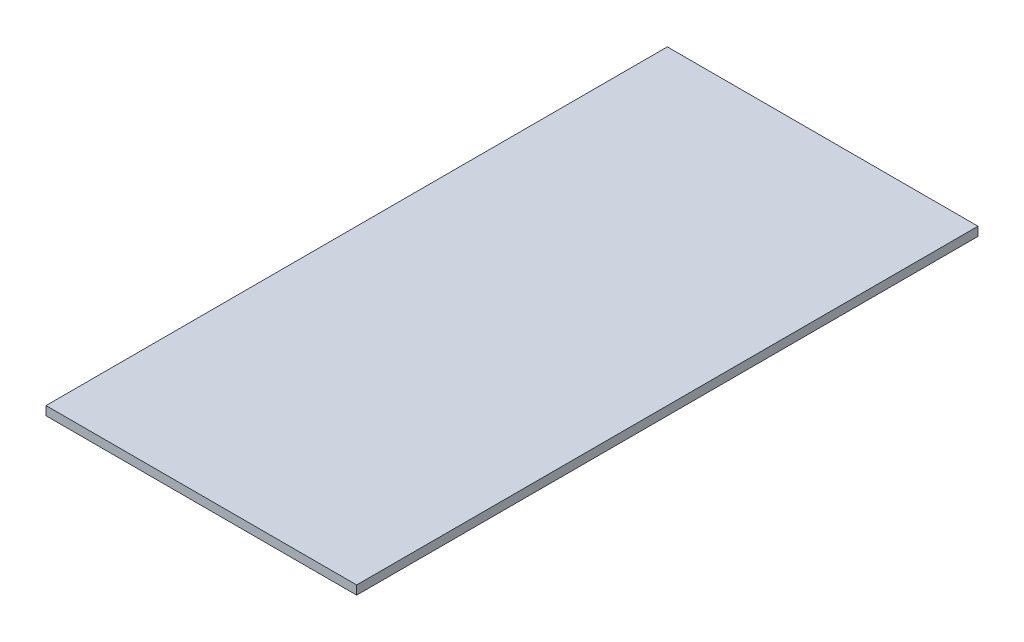
ISO-10303-21;
HEADER;
FILE_DESCRIPTION(('STEP AP214'),'2;1');
FILE_NAME('part.step','',(''),(''),'','','');
FILE_SCHEMA(('AUTOMOTIVE_DESIGN { 1 0 10303 214 1 1 1 1 }'));
ENDSEC;
DATA;
#1=APPLICATION_CONTEXT('core data for automotive mechanical design processes');
#2=APPLICATION_PROTOCOL_DEFINITION('international standard','automotive_design',2000,#1);
#3=PRODUCT_CONTEXT('',#1,'mechanical');
#4=PRODUCT('Part','Part','',(#3));
#5=PRODUCT_RELATED_PRODUCT_CATEGORY('part','',(#4));
#6=PRODUCT_DEFINITION_FORMATION('','',#4);
#7=PRODUCT_DEFINITION_CONTEXT('part definition',#1,'design');
#8=PRODUCT_DEFINITION('design','',#6,#7);
#9=PRODUCT_DEFINITION_SHAPE('','',#8);
#10=(LENGTH_UNIT() NAMED_UNIT(*) SI_UNIT(.MILLI.,.METRE.));
#11=(NAMED_UNIT(*) PLANE_ANGLE_UNIT() SI_UNIT($,.RADIAN.));
#12=(NAMED_UNIT(*) SI_UNIT($,.STERADIAN.) SOLID_ANGLE_UNIT());
#13=UNCERTAINTY_MEASURE_WITH_UNIT(LENGTH_MEASURE(1.E-05),#10,'distance_accuracy_value','');
#14=(GEOMETRIC_REPRESENTATION_CONTEXT(3) GLOBAL_UNCERTAINTY_ASSIGNED_CONTEXT((#13)) GLOBAL_UNIT_ASSIGNED_CONTEXT((#10,
#11,#12)) REPRESENTATION_CONTEXT('',''));
#15=CARTESIAN_POINT('',(0.,0.,0.));
#16=DIRECTION('',(0.,0.,1.));
#17=DIRECTION('',(1.,0.,0.));
#18=AXIS2_PLACEMENT_3D('',#15,#16,#17);
#19=CARTESIAN_POINT('',(5.,0.285,10.));
#20=DIRECTION('',(-1.,0.,0.));
#21=DIRECTION('',(0.,0.,1.));
#22=AXIS2_PLACEMENT_3D('',#19,#20,#21);
#23=PLANE('',#22);
#24=DIRECTION('',(0.,0.,-1.));
#25=VECTOR('',#24,1.);
#26=CARTESIAN_POINT('',(5.,0.,10.));
#27=LINE('',#26,#25);
#28=CARTESIAN_POINT('',(5.,0.,10.));
#29=VERTEX_POINT('',#28);
#30=CARTESIAN_POINT('',(5.,0.,-10.));
#31=VERTEX_POINT('',#30);
#32=EDGE_CURVE('E111',#29,#31,#27,.T.);
#33=ORIENTED_EDGE('',*,*,#32,.T.);
#34=DIRECTION('',(0.,-1.,0.));
#35=VECTOR('',#34,1.);
#36=CARTESIAN_POINT('',(5.,0.285,-10.));
#37=LINE('',#36,#35);
#38=CARTESIAN_POINT('',(5.,0.285,-10.));
#39=VERTEX_POINT('',#38);
#40=EDGE_CURVE('E11',#39,#31,#37,.T.);
#41=ORIENTED_EDGE('',*,*,#40,.F.);
#42=DIRECTION('',(0.,0.,-1.));
#43=VECTOR('',#42,1.);
#44=CARTESIAN_POINT('',(5.,0.285,10.));
#45=LINE('',#44,#43);
#46=CARTESIAN_POINT('',(5.,0.285,10.));
#47=VERTEX_POINT('',#46);
#48=EDGE_CURVE('E95',#47,#39,#45,.T.);
#49=ORIENTED_EDGE('',*,*,#48,.F.);
#50=DIRECTION('',(0.,-1.,0.));
#51=VECTOR('',#50,1.);
#52=CARTESIAN_POINT('',(5.,0.285,10.));
#53=LINE('',#52,#51);
#54=EDGE_CURVE('E107',#47,#29,#53,.T.);
#55=ORIENTED_EDGE('',*,*,#54,.T.);
#56=EDGE_LOOP('',(#33,#41,#49,#55));
#57=FACE_BOUND('',#56,.T.);
#58=ADVANCED_FACE('F43',(#57),#23,.F.);
#59=CARTESIAN_POINT('',(-5.,0.285,-10.));
#60=DIRECTION('',(0.,0.,1.));
#61=DIRECTION('',(1.,0.,0.));
#62=AXIS2_PLACEMENT_3D('',#59,#60,#61);
#63=PLANE('',#62);
#64=DIRECTION('',(-1.,0.,0.));
#65=VECTOR('',#64,1.);
#66=CARTESIAN_POINT('',(-5.,0.,-10.));
#67=LINE('',#66,#65);
#68=CARTESIAN_POINT('',(-5.,0.,-10.));
#69=VERTEX_POINT('',#68);
#70=EDGE_CURVE('E100',#31,#69,#67,.T.);
#71=ORIENTED_EDGE('',*,*,#70,.T.);
#72=DIRECTION('',(0.,-1.,0.));
#73=VECTOR('',#72,1.);
#74=CARTESIAN_POINT('',(-5.,0.285,-10.));
#75=LINE('',#74,#73);
#76=CARTESIAN_POINT('',(-5.,0.285,-10.));
#77=VERTEX_POINT('',#76);
#78=EDGE_CURVE('E52',#77,#69,#75,.T.);
#79=ORIENTED_EDGE('',*,*,#78,.F.);
#80=DIRECTION('',(-1.,0.,0.));
#81=VECTOR('',#80,1.);
#82=CARTESIAN_POINT('',(-5.,0.285,-10.));
#83=LINE('',#82,#81);
#84=EDGE_CURVE('E90',#39,#77,#83,.T.);
#85=ORIENTED_EDGE('',*,*,#84,.F.);
#86=ORIENTED_EDGE('',*,*,#40,.T.);
#87=EDGE_LOOP('',(#71,#79,#85,#86));
#88=FACE_BOUND('',#87,.T.);
#89=ADVANCED_FACE('F99',(#88),#63,.F.);
#90=CARTESIAN_POINT('',(-5.,0.285,10.));
#91=DIRECTION('',(1.,0.,0.));
#92=DIRECTION('',(0.,0.,-1.));
#93=AXIS2_PLACEMENT_3D('',#90,#91,#92);
#94=PLANE('',#93);
#95=DIRECTION('',(0.,0.,1.));
#96=VECTOR('',#95,1.);
#97=CARTESIAN_POINT('',(-5.,0.,10.));
#98=LINE('',#97,#96);
#99=CARTESIAN_POINT('',(-5.,0.,10.));
#100=VERTEX_POINT('',#99);
#101=EDGE_CURVE('E77',#69,#100,#98,.T.);
#102=ORIENTED_EDGE('',*,*,#101,.T.);
#103=DIRECTION('',(0.,-1.,0.));
#104=VECTOR('',#103,1.);
#105=CARTESIAN_POINT('',(-5.,0.285,10.));
#106=LINE('',#105,#104);
#107=CARTESIAN_POINT('',(-5.,0.285,10.));
#108=VERTEX_POINT('',#107);
#109=EDGE_CURVE('E102',#108,#100,#106,.T.);
#110=ORIENTED_EDGE('',*,*,#109,.F.);
#111=DIRECTION('',(0.,0.,1.));
#112=VECTOR('',#111,1.);
#113=CARTESIAN_POINT('',(-5.,0.285,10.));
#114=LINE('',#113,#112);
#115=EDGE_CURVE('E93',#77,#108,#114,.T.);
#116=ORIENTED_EDGE('',*,*,#115,.F.);
#117=ORIENTED_EDGE('',*,*,#78,.T.);
#118=EDGE_LOOP('',(#102,#110,#116,#117));
#119=FACE_BOUND('',#118,.T.);
#120=ADVANCED_FACE('F103',(#119),#94,.F.);
#121=CARTESIAN_POINT('',(-5.,0.285,10.));
#122=DIRECTION('',(0.,0.,-1.));
#123=DIRECTION('',(-1.,0.,0.));
#124=AXIS2_PLACEMENT_3D('',#121,#122,#123);
#125=PLANE('',#124);
#126=DIRECTION('',(1.,0.,0.));
#127=VECTOR('',#126,1.);
#128=CARTESIAN_POINT('',(-5.,0.,10.));
#129=LINE('',#128,#127);
#130=EDGE_CURVE('E83',#100,#29,#129,.T.);
#131=ORIENTED_EDGE('',*,*,#130,.T.);
#132=ORIENTED_EDGE('',*,*,#54,.F.);
#133=DIRECTION('',(1.,0.,0.));
#134=VECTOR('',#133,1.);
#135=CARTESIAN_POINT('',(-5.,0.285,10.));
#136=LINE('',#135,#134);
#137=EDGE_CURVE('E60',#108,#47,#136,.T.);
#138=ORIENTED_EDGE('',*,*,#137,.F.);
#139=ORIENTED_EDGE('',*,*,#109,.T.);
#140=EDGE_LOOP('',(#131,#132,#138,#139));
#141=FACE_BOUND('',#140,.T.);
#142=ADVANCED_FACE('F124',(#141),#125,.F.);
#143=CARTESIAN_POINT('',(0.,0.285,0.));
#144=DIRECTION('',(0.,-1.,0.));
#145=DIRECTION('',(0.,0.,-1.));
#146=AXIS2_PLACEMENT_3D('',#143,#144,#145);
#147=PLANE('',#146);
#148=ORIENTED_EDGE('',*,*,#48,.T.);
#149=ORIENTED_EDGE('',*,*,#84,.T.);
#150=ORIENTED_EDGE('',*,*,#115,.T.);
#151=ORIENTED_EDGE('',*,*,#137,.T.);
#152=EDGE_LOOP('',(#148,#149,#150,#151));
#153=FACE_BOUND('',#152,.T.);
#154=ADVANCED_FACE('F91',(#153),#147,.F.);
#155=CARTESIAN_POINT('',(0.,0.,0.));
#156=DIRECTION('',(0.,-1.,0.));
#157=DIRECTION('',(0.,0.,-1.));
#158=AXIS2_PLACEMENT_3D('',#155,#156,#157);
#159=PLANE('',#158);
#160=ORIENTED_EDGE('',*,*,#32,.F.);
#161=ORIENTED_EDGE('',*,*,#130,.F.);
#162=ORIENTED_EDGE('',*,*,#101,.F.);
#163=ORIENTED_EDGE('',*,*,#70,.F.);
#164=EDGE_LOOP('',(#160,#161,#162,#163));
#165=FACE_BOUND('',#164,.T.);
#166=ADVANCED_FACE('F127',(#165),#159,.T.);
#167=CLOSED_SHELL('',(#58,#89,#120,#142,#154,#166));
#168=MANIFOLD_SOLID_BREP('B2',#167);
#169=ADVANCED_BREP_SHAPE_REPRESENTATION('',(#18,#168),#14);
#170=SHAPE_DEFINITION_REPRESENTATION(#9,#169);
ENDSEC;
END-ISO-10303-21;
